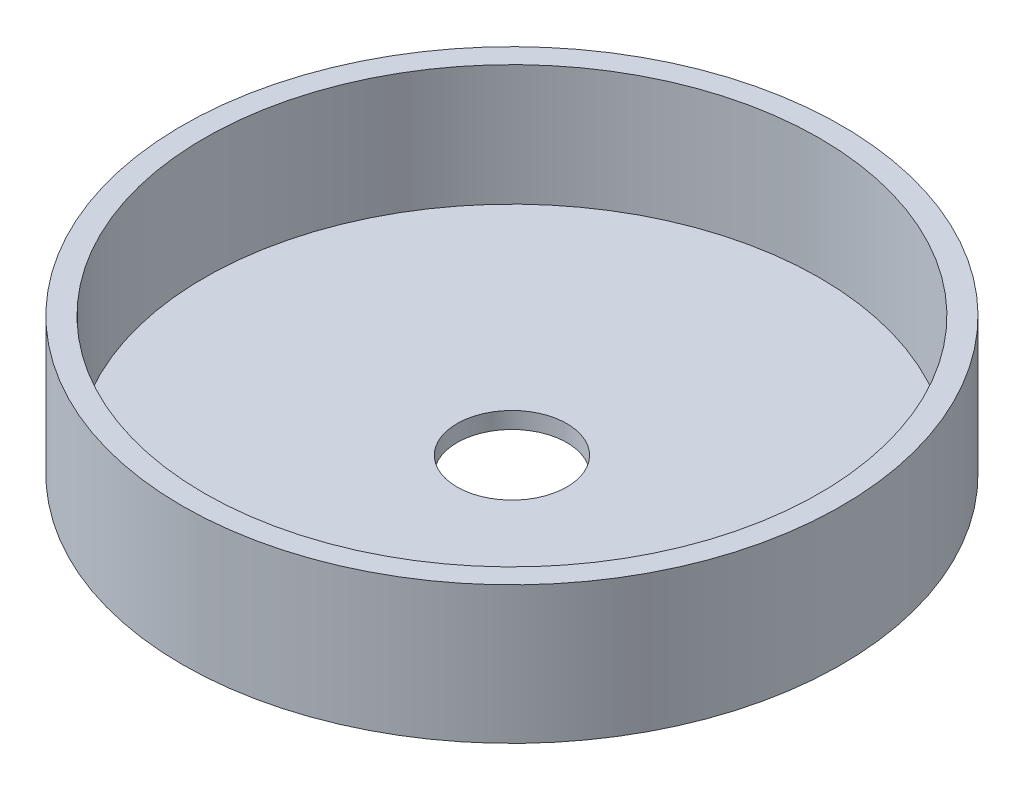
ISO-10303-21;
HEADER;
FILE_DESCRIPTION(('STEP AP214'),'2;1');
FILE_NAME('part.step','',(''),(''),'','','');
FILE_SCHEMA(('AUTOMOTIVE_DESIGN { 1 0 10303 214 1 1 1 1 }'));
ENDSEC;
DATA;
#1=APPLICATION_CONTEXT('core data for automotive mechanical design processes');
#2=APPLICATION_PROTOCOL_DEFINITION('international standard','automotive_design',2000,#1);
#3=PRODUCT_CONTEXT('',#1,'mechanical');
#4=PRODUCT('Part','Part','',(#3));
#5=PRODUCT_RELATED_PRODUCT_CATEGORY('part','',(#4));
#6=PRODUCT_DEFINITION_FORMATION('','',#4);
#7=PRODUCT_DEFINITION_CONTEXT('part definition',#1,'design');
#8=PRODUCT_DEFINITION('design','',#6,#7);
#9=PRODUCT_DEFINITION_SHAPE('','',#8);
#10=(LENGTH_UNIT() NAMED_UNIT(*) SI_UNIT(.MILLI.,.METRE.));
#11=(NAMED_UNIT(*) PLANE_ANGLE_UNIT() SI_UNIT($,.RADIAN.));
#12=(NAMED_UNIT(*) SI_UNIT($,.STERADIAN.) SOLID_ANGLE_UNIT());
#13=UNCERTAINTY_MEASURE_WITH_UNIT(LENGTH_MEASURE(1.E-05),#10,'distance_accuracy_value','');
#14=(GEOMETRIC_REPRESENTATION_CONTEXT(3) GLOBAL_UNCERTAINTY_ASSIGNED_CONTEXT((#13)) GLOBAL_UNIT_ASSIGNED_CONTEXT((#10,
#11,#12)) REPRESENTATION_CONTEXT('',''));
#15=CARTESIAN_POINT('',(0.,0.,0.));
#16=DIRECTION('',(0.,0.,1.));
#17=DIRECTION('',(1.,0.,0.));
#18=AXIS2_PLACEMENT_3D('',#15,#16,#17);
#19=CARTESIAN_POINT('',(0.,3.,0.));
#20=DIRECTION('',(0.,1.,0.));
#21=DIRECTION('',(0.,0.,1.));
#22=AXIS2_PLACEMENT_3D('',#19,#20,#21);
#23=PLANE('',#22);
#24=CARTESIAN_POINT('',(0.,3.,0.));
#25=DIRECTION('',(0.,1.,0.));
#26=DIRECTION('',(0.,0.,1.));
#27=AXIS2_PLACEMENT_3D('',#24,#25,#26);
#28=CIRCLE('',#27,10.);
#29=CARTESIAN_POINT('',(0.,3.,10.));
#30=VERTEX_POINT('',#29);
#31=EDGE_CURVE('E52',#30,#30,#28,.T.);
#32=ORIENTED_EDGE('',*,*,#31,.F.);
#33=EDGE_LOOP('',(#32));
#34=FACE_BOUND('',#33,.T.);
#35=CARTESIAN_POINT('',(0.,3.,0.));
#36=DIRECTION('',(0.,1.,0.));
#37=DIRECTION('',(0.,0.,1.));
#38=AXIS2_PLACEMENT_3D('',#35,#36,#37);
#39=CIRCLE('',#38,56.);
#40=CARTESIAN_POINT('',(0.,3.,56.));
#41=VERTEX_POINT('',#40);
#42=EDGE_CURVE('E10',#41,#41,#39,.F.);
#43=ORIENTED_EDGE('',*,*,#42,.F.);
#44=EDGE_LOOP('',(#43));
#45=FACE_BOUND('',#44,.T.);
#46=ADVANCED_FACE('F41',(#34,#45),#23,.T.);
#47=CARTESIAN_POINT('',(0.,0.,0.));
#48=DIRECTION('',(0.,1.,0.));
#49=DIRECTION('',(0.,0.,1.));
#50=AXIS2_PLACEMENT_3D('',#47,#48,#49);
#51=PLANE('',#50);
#52=CARTESIAN_POINT('',(0.,0.,0.));
#53=DIRECTION('',(0.,1.,0.));
#54=DIRECTION('',(0.,0.,1.));
#55=AXIS2_PLACEMENT_3D('',#52,#53,#54);
#56=CIRCLE('',#55,60.);
#57=CARTESIAN_POINT('',(0.,0.,60.));
#58=VERTEX_POINT('',#57);
#59=EDGE_CURVE('E44',#58,#58,#56,.T.);
#60=ORIENTED_EDGE('',*,*,#59,.F.);
#61=EDGE_LOOP('',(#60));
#62=FACE_BOUND('',#61,.T.);
#63=CARTESIAN_POINT('',(0.,0.,0.));
#64=DIRECTION('',(0.,1.,0.));
#65=DIRECTION('',(0.,0.,1.));
#66=AXIS2_PLACEMENT_3D('',#63,#64,#65);
#67=CIRCLE('',#66,10.);
#68=CARTESIAN_POINT('',(0.,0.,10.));
#69=VERTEX_POINT('',#68);
#70=EDGE_CURVE('E56',#69,#69,#67,.T.);
#71=ORIENTED_EDGE('',*,*,#70,.T.);
#72=EDGE_LOOP('',(#71));
#73=FACE_BOUND('',#72,.T.);
#74=ADVANCED_FACE('F84',(#62,#73),#51,.F.);
#75=CARTESIAN_POINT('',(0.,3.,0.));
#76=DIRECTION('',(0.,-1.,0.));
#77=DIRECTION('',(0.,0.,-1.));
#78=AXIS2_PLACEMENT_3D('',#75,#76,#77);
#79=CYLINDRICAL_SURFACE('',#78,60.);
#80=ORIENTED_EDGE('',*,*,#59,.T.);
#81=EDGE_LOOP('',(#80));
#82=FACE_BOUND('',#81,.T.);
#83=CARTESIAN_POINT('',(0.,25.,0.));
#84=DIRECTION('',(0.,1.,0.));
#85=DIRECTION('',(0.,0.,1.));
#86=AXIS2_PLACEMENT_3D('',#83,#84,#85);
#87=CIRCLE('',#86,60.);
#88=CARTESIAN_POINT('',(0.,25.,60.));
#89=VERTEX_POINT('',#88);
#90=EDGE_CURVE('E57',#89,#89,#87,.T.);
#91=ORIENTED_EDGE('',*,*,#90,.F.);
#92=EDGE_LOOP('',(#91));
#93=FACE_BOUND('',#92,.T.);
#94=ADVANCED_FACE('F43',(#82,#93),#79,.T.);
#95=CARTESIAN_POINT('',(0.,3.,0.));
#96=DIRECTION('',(0.,-1.,0.));
#97=DIRECTION('',(0.,0.,-1.));
#98=AXIS2_PLACEMENT_3D('',#95,#96,#97);
#99=CYLINDRICAL_SURFACE('',#98,10.);
#100=ORIENTED_EDGE('',*,*,#31,.T.);
#101=EDGE_LOOP('',(#100));
#102=FACE_BOUND('',#101,.T.);
#103=ORIENTED_EDGE('',*,*,#70,.F.);
#104=EDGE_LOOP('',(#103));
#105=FACE_BOUND('',#104,.T.);
#106=ADVANCED_FACE('F74',(#102,#105),#99,.F.);
#107=CARTESIAN_POINT('',(0.,25.,0.));
#108=DIRECTION('',(0.,1.,0.));
#109=DIRECTION('',(0.,0.,1.));
#110=AXIS2_PLACEMENT_3D('',#107,#108,#109);
#111=PLANE('',#110);
#112=ORIENTED_EDGE('',*,*,#90,.T.);
#113=EDGE_LOOP('',(#112));
#114=FACE_BOUND('',#113,.T.);
#115=CARTESIAN_POINT('',(0.,25.,0.));
#116=DIRECTION('',(0.,1.,0.));
#117=DIRECTION('',(0.,0.,1.));
#118=AXIS2_PLACEMENT_3D('',#115,#116,#117);
#119=CIRCLE('',#118,56.);
#120=CARTESIAN_POINT('',(0.,25.,56.));
#121=VERTEX_POINT('',#120);
#122=EDGE_CURVE('E61',#121,#121,#119,.T.);
#123=ORIENTED_EDGE('',*,*,#122,.F.);
#124=EDGE_LOOP('',(#123));
#125=FACE_BOUND('',#124,.T.);
#126=ADVANCED_FACE('F75',(#114,#125),#111,.T.);
#127=CARTESIAN_POINT('',(0.,25.,0.));
#128=DIRECTION('',(0.,-1.,0.));
#129=DIRECTION('',(0.,0.,-1.));
#130=AXIS2_PLACEMENT_3D('',#127,#128,#129);
#131=CYLINDRICAL_SURFACE('',#130,56.);
#132=ORIENTED_EDGE('',*,*,#42,.T.);
#133=EDGE_LOOP('',(#132));
#134=FACE_BOUND('',#133,.T.);
#135=ORIENTED_EDGE('',*,*,#122,.T.);
#136=EDGE_LOOP('',(#135));
#137=FACE_BOUND('',#136,.T.);
#138=ADVANCED_FACE('F69',(#134,#137),#131,.F.);
#139=CLOSED_SHELL('',(#46,#74,#94,#106,#126,#138));
#140=MANIFOLD_SOLID_BREP('B2',#139);
#141=ADVANCED_BREP_SHAPE_REPRESENTATION('',(#18,#140),#14);
#142=SHAPE_DEFINITION_REPRESENTATION(#9,#141);
ENDSEC;
END-ISO-10303-21;
